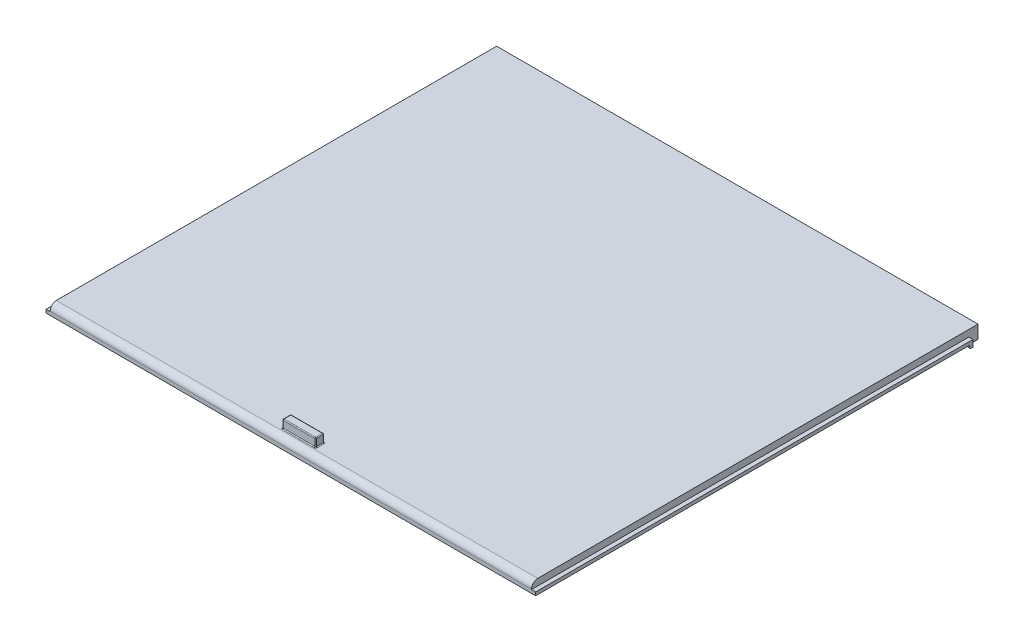
ISO-10303-21;
HEADER;
FILE_DESCRIPTION(('STEP AP214'),'2;1');
FILE_NAME('part.step','',(''),(''),'','','');
FILE_SCHEMA(('AUTOMOTIVE_DESIGN { 1 0 10303 214 1 1 1 1 }'));
ENDSEC;
DATA;
#1=APPLICATION_CONTEXT('core data for automotive mechanical design processes');
#2=APPLICATION_PROTOCOL_DEFINITION('international standard','automotive_design',2000,#1);
#3=PRODUCT_CONTEXT('',#1,'mechanical');
#4=PRODUCT('Part','Part','',(#3));
#5=PRODUCT_RELATED_PRODUCT_CATEGORY('part','',(#4));
#6=PRODUCT_DEFINITION_FORMATION('','',#4);
#7=PRODUCT_DEFINITION_CONTEXT('part definition',#1,'design');
#8=PRODUCT_DEFINITION('design','',#6,#7);
#9=PRODUCT_DEFINITION_SHAPE('','',#8);
#10=(LENGTH_UNIT() NAMED_UNIT(*) SI_UNIT(.MILLI.,.METRE.));
#11=(NAMED_UNIT(*) PLANE_ANGLE_UNIT() SI_UNIT($,.RADIAN.));
#12=(NAMED_UNIT(*) SI_UNIT($,.STERADIAN.) SOLID_ANGLE_UNIT());
#13=UNCERTAINTY_MEASURE_WITH_UNIT(LENGTH_MEASURE(1.E-05),#10,'distance_accuracy_value','');
#14=(GEOMETRIC_REPRESENTATION_CONTEXT(3) GLOBAL_UNCERTAINTY_ASSIGNED_CONTEXT((#13)) GLOBAL_UNIT_ASSIGNED_CONTEXT((#10,
#11,#12)) REPRESENTATION_CONTEXT('',''));
#15=CARTESIAN_POINT('',(0.,0.,0.));
#16=DIRECTION('',(0.,0.,1.));
#17=DIRECTION('',(1.,0.,0.));
#18=AXIS2_PLACEMENT_3D('',#15,#16,#17);
#19=CARTESIAN_POINT('',(29.5,-0.399999999999988,-52.7));
#20=DIRECTION('',(0.,0.,1.));
#21=DIRECTION('',(1.,0.,0.));
#22=AXIS2_PLACEMENT_3D('',#19,#20,#21);
#23=PLANE('',#22);
#24=DIRECTION('',(0.,1.,0.));
#25=VECTOR('',#24,1.);
#26=CARTESIAN_POINT('',(0.500000000000004,0.400000000000012,-52.7));
#27=LINE('',#26,#25);
#28=CARTESIAN_POINT('',(0.500000000000004,-0.399999999999988,-52.7));
#29=VERTEX_POINT('',#28);
#30=CARTESIAN_POINT('',(0.500000000000004,0.400000000000012,-52.7));
#31=VERTEX_POINT('',#30);
#32=EDGE_CURVE('E294',#29,#31,#27,.T.);
#33=ORIENTED_EDGE('',*,*,#32,.F.);
#34=DIRECTION('',(-1.,0.,0.));
#35=VECTOR('',#34,1.);
#36=CARTESIAN_POINT('',(29.5,-0.399999999999988,-52.7));
#37=LINE('',#36,#35);
#38=CARTESIAN_POINT('',(0.,-0.399999999999988,-52.7));
#39=VERTEX_POINT('',#38);
#40=EDGE_CURVE('E321',#29,#39,#37,.T.);
#41=ORIENTED_EDGE('',*,*,#40,.T.);
#42=DIRECTION('',(0.,1.,0.));
#43=VECTOR('',#42,1.);
#44=CARTESIAN_POINT('',(0.,-0.399999999999988,-52.7));
#45=LINE('',#44,#43);
#46=CARTESIAN_POINT('',(0.,0.400000000000012,-52.7));
#47=VERTEX_POINT('',#46);
#48=EDGE_CURVE('E306',#39,#47,#45,.T.);
#49=ORIENTED_EDGE('',*,*,#48,.T.);
#50=DIRECTION('',(-1.,0.,0.));
#51=VECTOR('',#50,1.);
#52=CARTESIAN_POINT('',(29.5,0.400000000000012,-52.7));
#53=LINE('',#52,#51);
#54=EDGE_CURVE('E319',#31,#47,#53,.T.);
#55=ORIENTED_EDGE('',*,*,#54,.F.);
#56=EDGE_LOOP('',(#33,#41,#49,#55));
#57=FACE_BOUND('',#56,.T.);
#58=ADVANCED_FACE('F33',(#57),#23,.F.);
#59=CARTESIAN_POINT('',(29.5,0.4,0.));
#60=DIRECTION('',(0.,-1.,0.));
#61=DIRECTION('',(0.,0.,-1.));
#62=AXIS2_PLACEMENT_3D('',#59,#60,#61);
#63=PLANE('',#62);
#64=DIRECTION('',(0.,0.,1.));
#65=VECTOR('',#64,1.);
#66=CARTESIAN_POINT('',(0.500000000000004,0.4,0.));
#67=LINE('',#66,#65);
#68=CARTESIAN_POINT('',(0.500000000000004,0.4,0.));
#69=VERTEX_POINT('',#68);
#70=EDGE_CURVE('E296',#31,#69,#67,.T.);
#71=ORIENTED_EDGE('',*,*,#70,.F.);
#72=ORIENTED_EDGE('',*,*,#54,.T.);
#73=DIRECTION('',(0.,0.,1.));
#74=VECTOR('',#73,1.);
#75=CARTESIAN_POINT('',(0.,0.4,0.));
#76=LINE('',#75,#74);
#77=CARTESIAN_POINT('',(0.,0.4,0.));
#78=VERTEX_POINT('',#77);
#79=EDGE_CURVE('E309',#47,#78,#76,.T.);
#80=ORIENTED_EDGE('',*,*,#79,.T.);
#81=DIRECTION('',(-1.,0.,0.));
#82=VECTOR('',#81,1.);
#83=CARTESIAN_POINT('',(29.5,0.4,0.));
#84=LINE('',#83,#82);
#85=EDGE_CURVE('E317',#69,#78,#84,.T.);
#86=ORIENTED_EDGE('',*,*,#85,.F.);
#87=EDGE_LOOP('',(#71,#72,#80,#86));
#88=FACE_BOUND('',#87,.T.);
#89=ADVANCED_FACE('F560',(#88),#63,.F.);
#90=CARTESIAN_POINT('',(29.5,0.,-52.2843137254902));
#91=DIRECTION('',(0.,1.,0.));
#92=DIRECTION('',(0.,0.,1.));
#93=AXIS2_PLACEMENT_3D('',#90,#91,#92);
#94=PLANE('',#93);
#95=DIRECTION('',(0.,0.,-1.));
#96=VECTOR('',#95,1.);
#97=CARTESIAN_POINT('',(0.,0.,-52.2843137254902));
#98=LINE('',#97,#96);
#99=CARTESIAN_POINT('',(0.,0.,0.));
#100=VERTEX_POINT('',#99);
#101=CARTESIAN_POINT('',(0.,0.,-52.2843137254902));
#102=VERTEX_POINT('',#101);
#103=EDGE_CURVE('E228',#100,#102,#98,.T.);
#104=ORIENTED_EDGE('',*,*,#103,.T.);
#105=DIRECTION('',(-1.,0.,0.));
#106=VECTOR('',#105,1.);
#107=CARTESIAN_POINT('',(29.5,0.,-52.2843137254902));
#108=LINE('',#107,#106);
#109=CARTESIAN_POINT('',(59.,0.,-52.2843137254902));
#110=VERTEX_POINT('',#109);
#111=EDGE_CURVE('E324',#110,#102,#108,.T.);
#112=ORIENTED_EDGE('',*,*,#111,.F.);
#113=DIRECTION('',(0.,0.,-1.));
#114=VECTOR('',#113,1.);
#115=CARTESIAN_POINT('',(59.,0.,-52.2843137254902));
#116=LINE('',#115,#114);
#117=CARTESIAN_POINT('',(59.,0.,0.));
#118=VERTEX_POINT('',#117);
#119=EDGE_CURVE('E255',#118,#110,#116,.T.);
#120=ORIENTED_EDGE('',*,*,#119,.F.);
#121=DIRECTION('',(-1.,0.,0.));
#122=VECTOR('',#121,1.);
#123=CARTESIAN_POINT('',(29.5,0.,0.));
#124=LINE('',#123,#122);
#125=EDGE_CURVE('E314',#118,#100,#124,.T.);
#126=ORIENTED_EDGE('',*,*,#125,.T.);
#127=EDGE_LOOP('',(#104,#112,#120,#126));
#128=FACE_BOUND('',#127,.T.);
#129=ADVANCED_FACE('F566',(#128),#94,.F.);
#130=CARTESIAN_POINT('',(29.5,0.,-52.2843137254902));
#131=DIRECTION('',(0.,0.,-1.));
#132=DIRECTION('',(-1.,0.,0.));
#133=AXIS2_PLACEMENT_3D('',#130,#131,#132);
#134=PLANE('',#133);
#135=DIRECTION('',(0.,-1.,0.));
#136=VECTOR('',#135,1.);
#137=CARTESIAN_POINT('',(0.,0.,-52.2843137254902));
#138=LINE('',#137,#136);
#139=CARTESIAN_POINT('',(0.,-0.199999999999988,-52.2843137254902));
#140=VERTEX_POINT('',#139);
#141=EDGE_CURVE('E301',#102,#140,#138,.T.);
#142=ORIENTED_EDGE('',*,*,#141,.T.);
#143=DIRECTION('',(-1.,0.,0.));
#144=VECTOR('',#143,1.);
#145=CARTESIAN_POINT('',(29.5,-0.199999999999988,-52.2843137254902));
#146=LINE('',#145,#144);
#147=CARTESIAN_POINT('',(59.,-0.199999999999988,-52.2843137254902));
#148=VERTEX_POINT('',#147);
#149=EDGE_CURVE('E337',#140,#148,#146,.F.);
#150=ORIENTED_EDGE('',*,*,#149,.T.);
#151=DIRECTION('',(0.,-1.,0.));
#152=VECTOR('',#151,1.);
#153=CARTESIAN_POINT('',(59.,0.,-52.2843137254902));
#154=LINE('',#153,#152);
#155=EDGE_CURVE('E258',#110,#148,#154,.T.);
#156=ORIENTED_EDGE('',*,*,#155,.F.);
#157=ORIENTED_EDGE('',*,*,#111,.T.);
#158=EDGE_LOOP('',(#142,#150,#156,#157));
#159=FACE_BOUND('',#158,.T.);
#160=ADVANCED_FACE('F576',(#159),#134,.F.);
#161=CARTESIAN_POINT('',(29.5,-0.399999999999988,-52.2843137254902));
#162=DIRECTION('',(0.,1.,0.));
#163=DIRECTION('',(0.,0.,1.));
#164=AXIS2_PLACEMENT_3D('',#161,#162,#163);
#165=PLANE('',#164);
#166=DIRECTION('',(1.,0.,0.));
#167=VECTOR('',#166,1.);
#168=CARTESIAN_POINT('',(0.500000000000004,-0.399999999999988,-53.8));
#169=LINE('',#168,#167);
#170=CARTESIAN_POINT('',(0.500000000000004,-0.399999999999988,-53.8));
#171=VERTEX_POINT('',#170);
#172=CARTESIAN_POINT('',(58.5,-0.399999999999988,-53.8));
#173=VERTEX_POINT('',#172);
#174=EDGE_CURVE('E229',#171,#173,#169,.T.);
#175=ORIENTED_EDGE('',*,*,#174,.T.);
#176=DIRECTION('',(0.,0.,1.));
#177=VECTOR('',#176,1.);
#178=CARTESIAN_POINT('',(58.5,-0.399999999999988,-52.7));
#179=LINE('',#178,#177);
#180=CARTESIAN_POINT('',(58.5,-0.399999999999988,-52.7));
#181=VERTEX_POINT('',#180);
#182=EDGE_CURVE('E237',#173,#181,#179,.T.);
#183=ORIENTED_EDGE('',*,*,#182,.T.);
#184=DIRECTION('',(1.,0.,0.));
#185=VECTOR('',#184,1.);
#186=CARTESIAN_POINT('',(29.5,-0.399999999999988,-52.7));
#187=LINE('',#186,#185);
#188=CARTESIAN_POINT('',(59.,-0.399999999999988,-52.7));
#189=VERTEX_POINT('',#188);
#190=EDGE_CURVE('E278',#181,#189,#187,.T.);
#191=ORIENTED_EDGE('',*,*,#190,.T.);
#192=DIRECTION('',(0.,0.,-1.));
#193=VECTOR('',#192,1.);
#194=CARTESIAN_POINT('',(59.,-0.399999999999988,-52.2843137254902));
#195=LINE('',#194,#193);
#196=CARTESIAN_POINT('',(59.,-0.399999999999988,-52.4843137254902));
#197=VERTEX_POINT('',#196);
#198=EDGE_CURVE('E261',#197,#189,#195,.T.);
#199=ORIENTED_EDGE('',*,*,#198,.F.);
#200=DIRECTION('',(-1.,0.,0.));
#201=VECTOR('',#200,1.);
#202=CARTESIAN_POINT('',(29.5,-0.399999999999988,-52.4843137254902));
#203=LINE('',#202,#201);
#204=CARTESIAN_POINT('',(0.,-0.399999999999988,-52.4843137254902));
#205=VERTEX_POINT('',#204);
#206=EDGE_CURVE('E332',#197,#205,#203,.T.);
#207=ORIENTED_EDGE('',*,*,#206,.T.);
#208=DIRECTION('',(0.,0.,-1.));
#209=VECTOR('',#208,1.);
#210=CARTESIAN_POINT('',(0.,-0.399999999999988,-52.2843137254902));
#211=LINE('',#210,#209);
#212=EDGE_CURVE('E304',#205,#39,#211,.T.);
#213=ORIENTED_EDGE('',*,*,#212,.T.);
#214=ORIENTED_EDGE('',*,*,#40,.F.);
#215=DIRECTION('',(0.,0.,1.));
#216=VECTOR('',#215,1.);
#217=CARTESIAN_POINT('',(0.500000000000004,-0.399999999999988,-52.7));
#218=LINE('',#217,#216);
#219=EDGE_CURVE('E292',#171,#29,#218,.T.);
#220=ORIENTED_EDGE('',*,*,#219,.F.);
#221=EDGE_LOOP('',(#175,#183,#191,#199,#207,#213,#214,#220));
#222=FACE_BOUND('',#221,.T.);
#223=ADVANCED_FACE('F572',(#222),#165,.F.);
#224=CARTESIAN_POINT('',(29.5,0.,0.));
#225=DIRECTION('',(0.,0.,-1.));
#226=DIRECTION('',(-1.,0.,0.));
#227=AXIS2_PLACEMENT_3D('',#224,#225,#226);
#228=PLANE('',#227);
#229=ORIENTED_EDGE('',*,*,#125,.F.);
#230=DIRECTION('',(0.,-1.,0.));
#231=VECTOR('',#230,1.);
#232=CARTESIAN_POINT('',(59.,0.,0.));
#233=LINE('',#232,#231);
#234=CARTESIAN_POINT('',(59.,0.4,0.));
#235=VERTEX_POINT('',#234);
#236=EDGE_CURVE('E269',#235,#118,#233,.T.);
#237=ORIENTED_EDGE('',*,*,#236,.F.);
#238=DIRECTION('',(1.,0.,0.));
#239=VECTOR('',#238,1.);
#240=CARTESIAN_POINT('',(29.5,0.4,0.));
#241=LINE('',#240,#239);
#242=CARTESIAN_POINT('',(58.5,0.4,0.));
#243=VERTEX_POINT('',#242);
#244=EDGE_CURVE('E272',#243,#235,#241,.T.);
#245=ORIENTED_EDGE('',*,*,#244,.F.);
#246=DIRECTION('',(0.,1.,0.));
#247=VECTOR('',#246,1.);
#248=CARTESIAN_POINT('',(58.5,1.2,0.));
#249=LINE('',#248,#247);
#250=CARTESIAN_POINT('',(58.5,0.45,0.));
#251=VERTEX_POINT('',#250);
#252=EDGE_CURVE('E243',#243,#251,#249,.T.);
#253=ORIENTED_EDGE('',*,*,#252,.T.);
#254=DIRECTION('',(1.,0.,0.));
#255=VECTOR('',#254,1.);
#256=CARTESIAN_POINT('',(29.5,0.45,0.));
#257=LINE('',#256,#255);
#258=CARTESIAN_POINT('',(0.500000000000004,0.45,0.));
#259=VERTEX_POINT('',#258);
#260=EDGE_CURVE('E328',#251,#259,#257,.F.);
#261=ORIENTED_EDGE('',*,*,#260,.T.);
#262=DIRECTION('',(0.,1.,0.));
#263=VECTOR('',#262,1.);
#264=CARTESIAN_POINT('',(0.500000000000004,1.2,0.));
#265=LINE('',#264,#263);
#266=EDGE_CURVE('E286',#69,#259,#265,.T.);
#267=ORIENTED_EDGE('',*,*,#266,.F.);
#268=ORIENTED_EDGE('',*,*,#85,.T.);
#269=DIRECTION('',(0.,-1.,0.));
#270=VECTOR('',#269,1.);
#271=CARTESIAN_POINT('',(0.,0.,0.));
#272=LINE('',#271,#270);
#273=EDGE_CURVE('E312',#78,#100,#272,.T.);
#274=ORIENTED_EDGE('',*,*,#273,.T.);
#275=EDGE_LOOP('',(#229,#237,#245,#253,#261,#267,#268,#274));
#276=FACE_BOUND('',#275,.T.);
#277=ADVANCED_FACE('F575',(#276),#228,.F.);
#278=CARTESIAN_POINT('',(0.,0.,0.));
#279=DIRECTION('',(-1.,0.,0.));
#280=DIRECTION('',(0.,0.,1.));
#281=AXIS2_PLACEMENT_3D('',#278,#279,#280);
#282=PLANE('',#281);
#283=ORIENTED_EDGE('',*,*,#212,.F.);
#284=CARTESIAN_POINT('',(0.,-0.199999999999988,-52.4843137254902));
#285=DIRECTION('',(-1.,0.,0.));
#286=DIRECTION('',(0.,0.,1.));
#287=AXIS2_PLACEMENT_3D('',#284,#285,#286);
#288=CIRCLE('',#287,0.2);
#289=EDGE_CURVE('E335',#205,#140,#288,.T.);
#290=ORIENTED_EDGE('',*,*,#289,.T.);
#291=ORIENTED_EDGE('',*,*,#141,.F.);
#292=ORIENTED_EDGE('',*,*,#103,.F.);
#293=ORIENTED_EDGE('',*,*,#273,.F.);
#294=ORIENTED_EDGE('',*,*,#79,.F.);
#295=ORIENTED_EDGE('',*,*,#48,.F.);
#296=EDGE_LOOP('',(#283,#290,#291,#292,#293,#294,#295));
#297=FACE_BOUND('',#296,.T.);
#298=ADVANCED_FACE('F727',(#297),#282,.T.);
#299=CARTESIAN_POINT('',(0.500000000000004,1.2,-53.8));
#300=DIRECTION('',(0.,-1.,0.));
#301=DIRECTION('',(0.,0.,-1.));
#302=AXIS2_PLACEMENT_3D('',#299,#300,#301);
#303=PLANE('',#302);
#304=CARTESIAN_POINT('',(31.4,1.2,-1.09614138385164));
#305=DIRECTION('',(0.,-1.,0.));
#306=DIRECTION('',(0.,0.,-1.));
#307=AXIS2_PLACEMENT_3D('',#304,#305,#306);
#308=CIRCLE('',#307,0.2);
#309=CARTESIAN_POINT('',(31.4,1.2,-0.896141383851641));
#310=VERTEX_POINT('',#309);
#311=CARTESIAN_POINT('',(31.6,1.2,-1.09614138385164));
#312=VERTEX_POINT('',#311);
#313=EDGE_CURVE('E53',#310,#312,#308,.F.);
#314=ORIENTED_EDGE('',*,*,#313,.F.);
#315=DIRECTION('',(-1.,0.,0.));
#316=VECTOR('',#315,1.);
#317=CARTESIAN_POINT('',(0.500000000000004,1.2,-0.896141383851641));
#318=LINE('',#317,#316);
#319=CARTESIAN_POINT('',(27.6,1.2,-0.896141383851641));
#320=VERTEX_POINT('',#319);
#321=EDGE_CURVE('E11',#310,#320,#318,.T.);
#322=ORIENTED_EDGE('',*,*,#321,.T.);
#323=CARTESIAN_POINT('',(27.6,1.2,-1.09614138385164));
#324=DIRECTION('',(0.,-1.,0.));
#325=DIRECTION('',(0.,0.,-1.));
#326=AXIS2_PLACEMENT_3D('',#323,#324,#325);
#327=CIRCLE('',#326,0.2);
#328=CARTESIAN_POINT('',(27.4,1.2,-1.09614138385164));
#329=VERTEX_POINT('',#328);
#330=EDGE_CURVE('E42',#329,#320,#327,.F.);
#331=ORIENTED_EDGE('',*,*,#330,.F.);
#332=DIRECTION('',(0.,0.,-1.));
#333=VECTOR('',#332,1.);
#334=CARTESIAN_POINT('',(27.4,1.2,-53.8));
#335=LINE('',#334,#333);
#336=CARTESIAN_POINT('',(27.4,1.2,-1.89614138385164));
#337=VERTEX_POINT('',#336);
#338=EDGE_CURVE('E393',#329,#337,#335,.T.);
#339=ORIENTED_EDGE('',*,*,#338,.T.);
#340=CARTESIAN_POINT('',(27.6,1.2,-1.89614138385164));
#341=DIRECTION('',(0.,-1.,0.));
#342=DIRECTION('',(0.,0.,-1.));
#343=AXIS2_PLACEMENT_3D('',#340,#341,#342);
#344=CIRCLE('',#343,0.2);
#345=CARTESIAN_POINT('',(27.6,1.2,-2.09614138385164));
#346=VERTEX_POINT('',#345);
#347=EDGE_CURVE('E391',#346,#337,#344,.F.);
#348=ORIENTED_EDGE('',*,*,#347,.F.);
#349=DIRECTION('',(-1.,0.,0.));
#350=VECTOR('',#349,1.);
#351=CARTESIAN_POINT('',(0.500000000000004,1.2,-2.09614138385164));
#352=LINE('',#351,#350);
#353=CARTESIAN_POINT('',(31.4,1.2,-2.09614138385164));
#354=VERTEX_POINT('',#353);
#355=EDGE_CURVE('E387',#346,#354,#352,.F.);
#356=ORIENTED_EDGE('',*,*,#355,.T.);
#357=CARTESIAN_POINT('',(31.4,1.2,-1.89614138385164));
#358=DIRECTION('',(0.,-1.,0.));
#359=DIRECTION('',(0.,0.,-1.));
#360=AXIS2_PLACEMENT_3D('',#357,#358,#359);
#361=CIRCLE('',#360,0.2);
#362=CARTESIAN_POINT('',(31.6,1.2,-1.89614138385164));
#363=VERTEX_POINT('',#362);
#364=EDGE_CURVE('E384',#363,#354,#361,.F.);
#365=ORIENTED_EDGE('',*,*,#364,.F.);
#366=DIRECTION('',(0.,0.,-1.));
#367=VECTOR('',#366,1.);
#368=CARTESIAN_POINT('',(31.6,1.2,-53.8));
#369=LINE('',#368,#367);
#370=EDGE_CURVE('E389',#363,#312,#369,.F.);
#371=ORIENTED_EDGE('',*,*,#370,.T.);
#372=EDGE_LOOP('',(#314,#322,#331,#339,#348,#356,#365,#371));
#373=FACE_BOUND('',#372,.T.);
#374=DIRECTION('',(0.,0.,-1.));
#375=VECTOR('',#374,1.);
#376=CARTESIAN_POINT('',(0.500000000000004,1.2,-53.8));
#377=LINE('',#376,#375);
#378=CARTESIAN_POINT('',(0.500000000000004,1.2,-0.750000000000015));
#379=VERTEX_POINT('',#378);
#380=CARTESIAN_POINT('',(0.500000000000004,1.2,-53.8));
#381=VERTEX_POINT('',#380);
#382=EDGE_CURVE('E289',#379,#381,#377,.T.);
#383=ORIENTED_EDGE('',*,*,#382,.F.);
#384=DIRECTION('',(1.,0.,0.));
#385=VECTOR('',#384,1.);
#386=CARTESIAN_POINT('',(0.500000000000004,1.2,-0.750000000000001));
#387=LINE('',#386,#385);
#388=CARTESIAN_POINT('',(58.5,1.2,-0.750000000000015));
#389=VERTEX_POINT('',#388);
#390=EDGE_CURVE('E241',#379,#389,#387,.T.);
#391=ORIENTED_EDGE('',*,*,#390,.T.);
#392=DIRECTION('',(0.,0.,-1.));
#393=VECTOR('',#392,1.);
#394=CARTESIAN_POINT('',(58.5,1.2,-53.8));
#395=LINE('',#394,#393);
#396=CARTESIAN_POINT('',(58.5,1.2,-53.8));
#397=VERTEX_POINT('',#396);
#398=EDGE_CURVE('E235',#389,#397,#395,.T.);
#399=ORIENTED_EDGE('',*,*,#398,.T.);
#400=DIRECTION('',(1.,0.,0.));
#401=VECTOR('',#400,1.);
#402=CARTESIAN_POINT('',(0.500000000000004,1.2,-53.8));
#403=LINE('',#402,#401);
#404=EDGE_CURVE('E218',#381,#397,#403,.T.);
#405=ORIENTED_EDGE('',*,*,#404,.F.);
#406=EDGE_LOOP('',(#383,#391,#399,#405));
#407=FACE_BOUND('',#406,.T.);
#408=ADVANCED_FACE('F239',(#373,#407),#303,.F.);
#409=CARTESIAN_POINT('',(0.500000000000004,-0.399999999999988,-53.8));
#410=DIRECTION('',(0.,0.,1.));
#411=DIRECTION('',(1.,0.,0.));
#412=AXIS2_PLACEMENT_3D('',#409,#410,#411);
#413=PLANE('',#412);
#414=ORIENTED_EDGE('',*,*,#404,.T.);
#415=DIRECTION('',(0.,-1.,0.));
#416=VECTOR('',#415,1.);
#417=CARTESIAN_POINT('',(58.5,-0.399999999999988,-53.8));
#418=LINE('',#417,#416);
#419=EDGE_CURVE('E222',#397,#173,#418,.T.);
#420=ORIENTED_EDGE('',*,*,#419,.T.);
#421=ORIENTED_EDGE('',*,*,#174,.F.);
#422=DIRECTION('',(0.,-1.,0.));
#423=VECTOR('',#422,1.);
#424=CARTESIAN_POINT('',(0.500000000000004,-0.399999999999988,-53.8));
#425=LINE('',#424,#423);
#426=EDGE_CURVE('E224',#381,#171,#425,.T.);
#427=ORIENTED_EDGE('',*,*,#426,.F.);
#428=EDGE_LOOP('',(#414,#420,#421,#427));
#429=FACE_BOUND('',#428,.T.);
#430=ADVANCED_FACE('F220',(#429),#413,.F.);
#431=CARTESIAN_POINT('',(0.500000000000004,0.,0.));
#432=DIRECTION('',(1.,0.,0.));
#433=DIRECTION('',(0.,0.,-1.));
#434=AXIS2_PLACEMENT_3D('',#431,#432,#433);
#435=PLANE('',#434);
#436=ORIENTED_EDGE('',*,*,#266,.T.);
#437=CARTESIAN_POINT('',(0.500000000000004,0.45,-0.750000000000001));
#438=DIRECTION('',(1.,0.,0.));
#439=DIRECTION('',(0.,0.,-1.));
#440=AXIS2_PLACEMENT_3D('',#437,#438,#439);
#441=CIRCLE('',#440,0.75);
#442=EDGE_CURVE('E330',#259,#379,#441,.F.);
#443=ORIENTED_EDGE('',*,*,#442,.T.);
#444=ORIENTED_EDGE('',*,*,#382,.T.);
#445=ORIENTED_EDGE('',*,*,#426,.T.);
#446=ORIENTED_EDGE('',*,*,#219,.T.);
#447=ORIENTED_EDGE('',*,*,#32,.T.);
#448=ORIENTED_EDGE('',*,*,#70,.T.);
#449=EDGE_LOOP('',(#436,#443,#444,#445,#446,#447,#448));
#450=FACE_BOUND('',#449,.T.);
#451=ADVANCED_FACE('F588',(#450),#435,.F.);
#452=CARTESIAN_POINT('',(0.500000000000004,0.45,-0.750000000000001));
#453=DIRECTION('',(1.,0.,0.));
#454=DIRECTION('',(0.,0.,-1.));
#455=AXIS2_PLACEMENT_3D('',#452,#453,#454);
#456=CYLINDRICAL_SURFACE('',#455,0.75);
#457=ORIENTED_EDGE('',*,*,#442,.F.);
#458=ORIENTED_EDGE('',*,*,#260,.F.);
#459=CARTESIAN_POINT('',(58.5,0.45,-0.750000000000001));
#460=DIRECTION('',(1.,0.,0.));
#461=DIRECTION('',(0.,0.,-1.));
#462=AXIS2_PLACEMENT_3D('',#459,#460,#461);
#463=CIRCLE('',#462,0.75);
#464=EDGE_CURVE('E281',#251,#389,#463,.F.);
#465=ORIENTED_EDGE('',*,*,#464,.T.);
#466=ORIENTED_EDGE('',*,*,#390,.F.);
#467=EDGE_LOOP('',(#457,#458,#465,#466));
#468=FACE_BOUND('',#467,.T.);
#469=ADVANCED_FACE('F584',(#468),#456,.T.);
#470=CARTESIAN_POINT('',(29.5,-0.199999999999988,-52.4843137254902));
#471=DIRECTION('',(-1.,0.,0.));
#472=DIRECTION('',(0.,0.,1.));
#473=AXIS2_PLACEMENT_3D('',#470,#471,#472);
#474=CYLINDRICAL_SURFACE('',#473,0.2);
#475=ORIENTED_EDGE('',*,*,#206,.F.);
#476=CARTESIAN_POINT('',(59.,-0.199999999999988,-52.4843137254902));
#477=DIRECTION('',(-1.,0.,0.));
#478=DIRECTION('',(0.,0.,1.));
#479=AXIS2_PLACEMENT_3D('',#476,#477,#478);
#480=CIRCLE('',#479,0.2);
#481=EDGE_CURVE('E283',#197,#148,#480,.T.);
#482=ORIENTED_EDGE('',*,*,#481,.T.);
#483=ORIENTED_EDGE('',*,*,#149,.F.);
#484=ORIENTED_EDGE('',*,*,#289,.F.);
#485=EDGE_LOOP('',(#475,#482,#483,#484));
#486=FACE_BOUND('',#485,.T.);
#487=ADVANCED_FACE('F587',(#486),#474,.T.);
#488=CARTESIAN_POINT('',(29.5,-0.399999999999988,-52.7));
#489=DIRECTION('',(0.,0.,1.));
#490=DIRECTION('',(-1.,0.,0.));
#491=AXIS2_PLACEMENT_3D('',#488,#489,#490);
#492=PLANE('',#491);
#493=DIRECTION('',(0.,1.,0.));
#494=VECTOR('',#493,1.);
#495=CARTESIAN_POINT('',(58.5,0.400000000000012,-52.7));
#496=LINE('',#495,#494);
#497=CARTESIAN_POINT('',(58.5,0.400000000000012,-52.7));
#498=VERTEX_POINT('',#497);
#499=EDGE_CURVE('E249',#181,#498,#496,.T.);
#500=ORIENTED_EDGE('',*,*,#499,.T.);
#501=DIRECTION('',(1.,0.,0.));
#502=VECTOR('',#501,1.);
#503=CARTESIAN_POINT('',(29.5,0.400000000000012,-52.7));
#504=LINE('',#503,#502);
#505=CARTESIAN_POINT('',(59.,0.400000000000012,-52.7));
#506=VERTEX_POINT('',#505);
#507=EDGE_CURVE('E275',#498,#506,#504,.T.);
#508=ORIENTED_EDGE('',*,*,#507,.T.);
#509=DIRECTION('',(0.,1.,0.));
#510=VECTOR('',#509,1.);
#511=CARTESIAN_POINT('',(59.,-0.399999999999988,-52.7));
#512=LINE('',#511,#510);
#513=EDGE_CURVE('E263',#189,#506,#512,.T.);
#514=ORIENTED_EDGE('',*,*,#513,.F.);
#515=ORIENTED_EDGE('',*,*,#190,.F.);
#516=EDGE_LOOP('',(#500,#508,#514,#515));
#517=FACE_BOUND('',#516,.T.);
#518=ADVANCED_FACE('F592',(#517),#492,.F.);
#519=CARTESIAN_POINT('',(29.5,0.4,0.));
#520=DIRECTION('',(0.,-1.,0.));
#521=DIRECTION('',(0.,0.,-1.));
#522=AXIS2_PLACEMENT_3D('',#519,#520,#521);
#523=PLANE('',#522);
#524=DIRECTION('',(0.,0.,1.));
#525=VECTOR('',#524,1.);
#526=CARTESIAN_POINT('',(58.5,0.4,0.));
#527=LINE('',#526,#525);
#528=EDGE_CURVE('E252',#498,#243,#527,.T.);
#529=ORIENTED_EDGE('',*,*,#528,.T.);
#530=ORIENTED_EDGE('',*,*,#244,.T.);
#531=DIRECTION('',(0.,0.,1.));
#532=VECTOR('',#531,1.);
#533=CARTESIAN_POINT('',(59.,0.4,0.));
#534=LINE('',#533,#532);
#535=EDGE_CURVE('E266',#506,#235,#534,.T.);
#536=ORIENTED_EDGE('',*,*,#535,.F.);
#537=ORIENTED_EDGE('',*,*,#507,.F.);
#538=EDGE_LOOP('',(#529,#530,#536,#537));
#539=FACE_BOUND('',#538,.T.);
#540=ADVANCED_FACE('F681',(#539),#523,.F.);
#541=CARTESIAN_POINT('',(59.,0.,0.));
#542=DIRECTION('',(1.,0.,0.));
#543=DIRECTION('',(0.,0.,1.));
#544=AXIS2_PLACEMENT_3D('',#541,#542,#543);
#545=PLANE('',#544);
#546=ORIENTED_EDGE('',*,*,#198,.T.);
#547=ORIENTED_EDGE('',*,*,#513,.T.);
#548=ORIENTED_EDGE('',*,*,#535,.T.);
#549=ORIENTED_EDGE('',*,*,#236,.T.);
#550=ORIENTED_EDGE('',*,*,#119,.T.);
#551=ORIENTED_EDGE('',*,*,#155,.T.);
#552=ORIENTED_EDGE('',*,*,#481,.F.);
#553=EDGE_LOOP('',(#546,#547,#548,#549,#550,#551,#552));
#554=FACE_BOUND('',#553,.T.);
#555=ADVANCED_FACE('F675',(#554),#545,.T.);
#556=CARTESIAN_POINT('',(58.5,0.,0.));
#557=DIRECTION('',(-1.,0.,0.));
#558=DIRECTION('',(0.,0.,-1.));
#559=AXIS2_PLACEMENT_3D('',#556,#557,#558);
#560=PLANE('',#559);
#561=ORIENTED_EDGE('',*,*,#252,.F.);
#562=ORIENTED_EDGE('',*,*,#528,.F.);
#563=ORIENTED_EDGE('',*,*,#499,.F.);
#564=ORIENTED_EDGE('',*,*,#182,.F.);
#565=ORIENTED_EDGE('',*,*,#419,.F.);
#566=ORIENTED_EDGE('',*,*,#398,.F.);
#567=ORIENTED_EDGE('',*,*,#464,.F.);
#568=EDGE_LOOP('',(#561,#562,#563,#564,#565,#566,#567));
#569=FACE_BOUND('',#568,.T.);
#570=ADVANCED_FACE('F233',(#569),#560,.F.);
#571=CARTESIAN_POINT('',(31.5,1.2,-0.996141383851642));
#572=DIRECTION('',(0.,0.,1.));
#573=DIRECTION('',(-1.,0.,0.));
#574=AXIS2_PLACEMENT_3D('',#571,#572,#573);
#575=PLANE('',#574);
#576=DIRECTION('',(0.,-1.,0.));
#577=VECTOR('',#576,1.);
#578=CARTESIAN_POINT('',(31.4,1.2,-0.996141383851642));
#579=LINE('',#578,#577);
#580=CARTESIAN_POINT('',(31.4,1.3,-0.996141383851642));
#581=VERTEX_POINT('',#580);
#582=CARTESIAN_POINT('',(31.4,2.1,-0.996141383851642));
#583=VERTEX_POINT('',#582);
#584=EDGE_CURVE('E377',#581,#583,#579,.F.);
#585=ORIENTED_EDGE('',*,*,#584,.T.);
#586=DIRECTION('',(-1.,0.,0.));
#587=VECTOR('',#586,1.);
#588=CARTESIAN_POINT('',(31.5,2.1,-0.996141383851642));
#589=LINE('',#588,#587);
#590=CARTESIAN_POINT('',(27.6,2.1,-0.996141383851642));
#591=VERTEX_POINT('',#590);
#592=EDGE_CURVE('E381',#583,#591,#589,.T.);
#593=ORIENTED_EDGE('',*,*,#592,.T.);
#594=DIRECTION('',(0.,-1.,0.));
#595=VECTOR('',#594,1.);
#596=CARTESIAN_POINT('',(27.6,1.2,-0.996141383851642));
#597=LINE('',#596,#595);
#598=CARTESIAN_POINT('',(27.6,1.3,-0.996141383851642));
#599=VERTEX_POINT('',#598);
#600=EDGE_CURVE('E379',#591,#599,#597,.T.);
#601=ORIENTED_EDGE('',*,*,#600,.T.);
#602=DIRECTION('',(-1.,0.,0.));
#603=VECTOR('',#602,1.);
#604=CARTESIAN_POINT('',(31.5,1.3,-0.996141383851642));
#605=LINE('',#604,#603);
#606=EDGE_CURVE('E375',#599,#581,#605,.F.);
#607=ORIENTED_EDGE('',*,*,#606,.T.);
#608=EDGE_LOOP('',(#585,#593,#601,#607));
#609=FACE_BOUND('',#608,.T.);
#610=ADVANCED_FACE('F550',(#609),#575,.T.);
#611=CARTESIAN_POINT('',(31.5,2.2,-0.996141383851642));
#612=DIRECTION('',(0.,1.,0.));
#613=DIRECTION('',(0.,0.,1.));
#614=AXIS2_PLACEMENT_3D('',#611,#612,#613);
#615=PLANE('',#614);
#616=DIRECTION('',(-1.,0.,0.));
#617=VECTOR('',#616,1.);
#618=CARTESIAN_POINT('',(31.5,2.2,-1.89614138385164));
#619=LINE('',#618,#617);
#620=CARTESIAN_POINT('',(31.4,2.2,-1.89614138385164));
#621=VERTEX_POINT('',#620);
#622=CARTESIAN_POINT('',(27.6,2.2,-1.89614138385164));
#623=VERTEX_POINT('',#622);
#624=EDGE_CURVE('E343',#621,#623,#619,.T.);
#625=ORIENTED_EDGE('',*,*,#624,.T.);
#626=DIRECTION('',(0.,0.,1.));
#627=VECTOR('',#626,1.);
#628=CARTESIAN_POINT('',(27.6,2.2,-0.996141383851642));
#629=LINE('',#628,#627);
#630=CARTESIAN_POINT('',(27.6,2.2,-1.09614138385164));
#631=VERTEX_POINT('',#630);
#632=EDGE_CURVE('E345',#623,#631,#629,.T.);
#633=ORIENTED_EDGE('',*,*,#632,.T.);
#634=DIRECTION('',(-1.,0.,0.));
#635=VECTOR('',#634,1.);
#636=CARTESIAN_POINT('',(31.5,2.2,-1.09614138385164));
#637=LINE('',#636,#635);
#638=CARTESIAN_POINT('',(31.4,2.2,-1.09614138385164));
#639=VERTEX_POINT('',#638);
#640=EDGE_CURVE('E339',#631,#639,#637,.F.);
#641=ORIENTED_EDGE('',*,*,#640,.T.);
#642=DIRECTION('',(0.,0.,1.));
#643=VECTOR('',#642,1.);
#644=CARTESIAN_POINT('',(31.4,2.2,-0.996141383851642));
#645=LINE('',#644,#643);
#646=EDGE_CURVE('E341',#639,#621,#645,.F.);
#647=ORIENTED_EDGE('',*,*,#646,.T.);
#648=EDGE_LOOP('',(#625,#633,#641,#647));
#649=FACE_BOUND('',#648,.T.);
#650=ADVANCED_FACE('F548',(#649),#615,.T.);
#651=CARTESIAN_POINT('',(31.5,2.2,-1.99614138385164));
#652=DIRECTION('',(0.,0.,-1.));
#653=DIRECTION('',(1.,0.,0.));
#654=AXIS2_PLACEMENT_3D('',#651,#652,#653);
#655=PLANE('',#654);
#656=DIRECTION('',(0.,1.,0.));
#657=VECTOR('',#656,1.);
#658=CARTESIAN_POINT('',(27.6,2.2,-1.99614138385164));
#659=LINE('',#658,#657);
#660=CARTESIAN_POINT('',(27.6,1.3,-1.99614138385164));
#661=VERTEX_POINT('',#660);
#662=CARTESIAN_POINT('',(27.6,2.1,-1.99614138385164));
#663=VERTEX_POINT('',#662);
#664=EDGE_CURVE('E361',#661,#663,#659,.T.);
#665=ORIENTED_EDGE('',*,*,#664,.T.);
#666=DIRECTION('',(-1.,0.,0.));
#667=VECTOR('',#666,1.);
#668=CARTESIAN_POINT('',(31.5,2.1,-1.99614138385164));
#669=LINE('',#668,#667);
#670=CARTESIAN_POINT('',(31.4,2.1,-1.99614138385164));
#671=VERTEX_POINT('',#670);
#672=EDGE_CURVE('E363',#663,#671,#669,.F.);
#673=ORIENTED_EDGE('',*,*,#672,.T.);
#674=DIRECTION('',(0.,1.,0.));
#675=VECTOR('',#674,1.);
#676=CARTESIAN_POINT('',(31.4,2.2,-1.99614138385164));
#677=LINE('',#676,#675);
#678=CARTESIAN_POINT('',(31.4,1.3,-1.99614138385164));
#679=VERTEX_POINT('',#678);
#680=EDGE_CURVE('E359',#671,#679,#677,.F.);
#681=ORIENTED_EDGE('',*,*,#680,.T.);
#682=DIRECTION('',(-1.,0.,0.));
#683=VECTOR('',#682,1.);
#684=CARTESIAN_POINT('',(31.5,1.3,-1.99614138385164));
#685=LINE('',#684,#683);
#686=EDGE_CURVE('E357',#679,#661,#685,.T.);
#687=ORIENTED_EDGE('',*,*,#686,.T.);
#688=EDGE_LOOP('',(#665,#673,#681,#687));
#689=FACE_BOUND('',#688,.T.);
#690=ADVANCED_FACE('F490',(#689),#655,.T.);
#691=CARTESIAN_POINT('',(31.5,0.,0.));
#692=DIRECTION('',(1.,0.,0.));
#693=DIRECTION('',(0.,0.,1.));
#694=AXIS2_PLACEMENT_3D('',#691,#692,#693);
#695=PLANE('',#694);
#696=DIRECTION('',(0.,1.,0.));
#697=VECTOR('',#696,1.);
#698=CARTESIAN_POINT('',(31.5,0.,-1.89614138385164));
#699=LINE('',#698,#697);
#700=CARTESIAN_POINT('',(31.5,1.3,-1.89614138385164));
#701=VERTEX_POINT('',#700);
#702=CARTESIAN_POINT('',(31.5,2.1,-1.89614138385164));
#703=VERTEX_POINT('',#702);
#704=EDGE_CURVE('E370',#701,#703,#699,.T.);
#705=ORIENTED_EDGE('',*,*,#704,.T.);
#706=DIRECTION('',(0.,0.,1.));
#707=VECTOR('',#706,1.);
#708=CARTESIAN_POINT('',(31.5,2.1,0.));
#709=LINE('',#708,#707);
#710=CARTESIAN_POINT('',(31.5,2.1,-1.09614138385164));
#711=VERTEX_POINT('',#710);
#712=EDGE_CURVE('E372',#703,#711,#709,.T.);
#713=ORIENTED_EDGE('',*,*,#712,.T.);
#714=DIRECTION('',(0.,-1.,0.));
#715=VECTOR('',#714,1.);
#716=CARTESIAN_POINT('',(31.5,0.,-1.09614138385164));
#717=LINE('',#716,#715);
#718=CARTESIAN_POINT('',(31.5,1.3,-1.09614138385164));
#719=VERTEX_POINT('',#718);
#720=EDGE_CURVE('E368',#711,#719,#717,.T.);
#721=ORIENTED_EDGE('',*,*,#720,.T.);
#722=DIRECTION('',(0.,0.,-1.));
#723=VECTOR('',#722,1.);
#724=CARTESIAN_POINT('',(31.5,1.3,0.));
#725=LINE('',#724,#723);
#726=EDGE_CURVE('E366',#719,#701,#725,.T.);
#727=ORIENTED_EDGE('',*,*,#726,.T.);
#728=EDGE_LOOP('',(#705,#713,#721,#727));
#729=FACE_BOUND('',#728,.T.);
#730=ADVANCED_FACE('F506',(#729),#695,.T.);
#731=CARTESIAN_POINT('',(27.5,0.,0.));
#732=DIRECTION('',(-1.,0.,0.));
#733=DIRECTION('',(0.,0.,1.));
#734=AXIS2_PLACEMENT_3D('',#731,#732,#733);
#735=PLANE('',#734);
#736=DIRECTION('',(0.,-1.,0.));
#737=VECTOR('',#736,1.);
#738=CARTESIAN_POINT('',(27.5,0.,-1.09614138385164));
#739=LINE('',#738,#737);
#740=CARTESIAN_POINT('',(27.5,1.3,-1.09614138385164));
#741=VERTEX_POINT('',#740);
#742=CARTESIAN_POINT('',(27.5,2.1,-1.09614138385164));
#743=VERTEX_POINT('',#742);
#744=EDGE_CURVE('E350',#741,#743,#739,.F.);
#745=ORIENTED_EDGE('',*,*,#744,.T.);
#746=DIRECTION('',(0.,0.,1.));
#747=VECTOR('',#746,1.);
#748=CARTESIAN_POINT('',(27.5,2.1,0.));
#749=LINE('',#748,#747);
#750=CARTESIAN_POINT('',(27.5,2.1,-1.89614138385164));
#751=VERTEX_POINT('',#750);
#752=EDGE_CURVE('E354',#743,#751,#749,.F.);
#753=ORIENTED_EDGE('',*,*,#752,.T.);
#754=DIRECTION('',(0.,1.,0.));
#755=VECTOR('',#754,1.);
#756=CARTESIAN_POINT('',(27.5,0.,-1.89614138385164));
#757=LINE('',#756,#755);
#758=CARTESIAN_POINT('',(27.5,1.3,-1.89614138385164));
#759=VERTEX_POINT('',#758);
#760=EDGE_CURVE('E352',#751,#759,#757,.F.);
#761=ORIENTED_EDGE('',*,*,#760,.T.);
#762=DIRECTION('',(0.,0.,-1.));
#763=VECTOR('',#762,1.);
#764=CARTESIAN_POINT('',(27.5,1.3,0.));
#765=LINE('',#764,#763);
#766=EDGE_CURVE('E348',#759,#741,#765,.F.);
#767=ORIENTED_EDGE('',*,*,#766,.T.);
#768=EDGE_LOOP('',(#745,#753,#761,#767));
#769=FACE_BOUND('',#768,.T.);
#770=ADVANCED_FACE('F531',(#769),#735,.T.);
#771=CARTESIAN_POINT('',(31.6,1.3,0.));
#772=DIRECTION('',(0.,0.,-1.));
#773=DIRECTION('',(-1.,0.,0.));
#774=AXIS2_PLACEMENT_3D('',#771,#772,#773);
#775=CYLINDRICAL_SURFACE('',#774,0.1);
#776=CARTESIAN_POINT('',(31.6,1.3,-1.09614138385164));
#777=DIRECTION('',(0.,0.,-1.));
#778=DIRECTION('',(-1.,0.,0.));
#779=AXIS2_PLACEMENT_3D('',#776,#777,#778);
#780=CIRCLE('',#779,0.1);
#781=EDGE_CURVE('E459',#312,#719,#780,.T.);
#782=ORIENTED_EDGE('',*,*,#781,.F.);
#783=ORIENTED_EDGE('',*,*,#370,.F.);
#784=CARTESIAN_POINT('',(31.6,1.3,-1.89614138385164));
#785=DIRECTION('',(0.,0.,1.));
#786=DIRECTION('',(1.,0.,0.));
#787=AXIS2_PLACEMENT_3D('',#784,#785,#786);
#788=CIRCLE('',#787,0.1);
#789=EDGE_CURVE('E37',#701,#363,#788,.T.);
#790=ORIENTED_EDGE('',*,*,#789,.F.);
#791=ORIENTED_EDGE('',*,*,#726,.F.);
#792=EDGE_LOOP('',(#782,#783,#790,#791));
#793=FACE_BOUND('',#792,.T.);
#794=ADVANCED_FACE('F35',(#793),#775,.F.);
#795=CARTESIAN_POINT('',(31.4,1.3,-1.89614138385164));
#796=DIRECTION('',(0.,-1.,0.));
#797=DIRECTION('',(0.,0.,-1.));
#798=AXIS2_PLACEMENT_3D('',#795,#796,#797);
#799=TOROIDAL_SURFACE('',#798,0.2,0.1);
#800=ORIENTED_EDGE('',*,*,#789,.T.);
#801=ORIENTED_EDGE('',*,*,#364,.T.);
#802=CARTESIAN_POINT('',(31.4,1.3,-2.09614138385164));
#803=DIRECTION('',(-1.,0.,0.));
#804=DIRECTION('',(0.,0.,1.));
#805=AXIS2_PLACEMENT_3D('',#802,#803,#804);
#806=CIRCLE('',#805,0.1);
#807=EDGE_CURVE('E457',#679,#354,#806,.F.);
#808=ORIENTED_EDGE('',*,*,#807,.F.);
#809=CARTESIAN_POINT('',(31.4,1.3,-1.89614138385164));
#810=DIRECTION('',(0.,-1.,0.));
#811=DIRECTION('',(0.,0.,-1.));
#812=AXIS2_PLACEMENT_3D('',#809,#810,#811);
#813=CIRCLE('',#812,0.1);
#814=EDGE_CURVE('E454',#701,#679,#813,.F.);
#815=ORIENTED_EDGE('',*,*,#814,.F.);
#816=EDGE_LOOP('',(#800,#801,#808,#815));
#817=FACE_BOUND('',#816,.T.);
#818=ADVANCED_FACE('F468',(#817),#799,.F.);
#819=CARTESIAN_POINT('',(31.4,1.3,-1.09614138385164));
#820=DIRECTION('',(0.,-1.,0.));
#821=DIRECTION('',(0.,0.,-1.));
#822=AXIS2_PLACEMENT_3D('',#819,#820,#821);
#823=TOROIDAL_SURFACE('',#822,0.2,0.1);
#824=ORIENTED_EDGE('',*,*,#313,.T.);
#825=ORIENTED_EDGE('',*,*,#781,.T.);
#826=CARTESIAN_POINT('',(31.4,1.3,-1.09614138385164));
#827=DIRECTION('',(0.,-1.,0.));
#828=DIRECTION('',(0.,0.,-1.));
#829=AXIS2_PLACEMENT_3D('',#826,#827,#828);
#830=CIRCLE('',#829,0.1);
#831=EDGE_CURVE('E451',#581,#719,#830,.F.);
#832=ORIENTED_EDGE('',*,*,#831,.F.);
#833=CARTESIAN_POINT('',(31.4,1.3,-0.896141383851642));
#834=DIRECTION('',(-1.,0.,0.));
#835=DIRECTION('',(0.,0.,1.));
#836=AXIS2_PLACEMENT_3D('',#833,#834,#835);
#837=CIRCLE('',#836,0.1);
#838=EDGE_CURVE('E448',#310,#581,#837,.F.);
#839=ORIENTED_EDGE('',*,*,#838,.F.);
#840=EDGE_LOOP('',(#824,#825,#832,#839));
#841=FACE_BOUND('',#840,.T.);
#842=ADVANCED_FACE('F518',(#841),#823,.F.);
#843=CARTESIAN_POINT('',(31.5,1.3,-2.09614138385164));
#844=DIRECTION('',(-1.,0.,0.));
#845=DIRECTION('',(0.,0.,1.));
#846=AXIS2_PLACEMENT_3D('',#843,#844,#845);
#847=CYLINDRICAL_SURFACE('',#846,0.1);
#848=ORIENTED_EDGE('',*,*,#807,.T.);
#849=ORIENTED_EDGE('',*,*,#355,.F.);
#850=CARTESIAN_POINT('',(27.6,1.3,-2.09614138385164));
#851=DIRECTION('',(1.,0.,0.));
#852=DIRECTION('',(0.,0.,-1.));
#853=AXIS2_PLACEMENT_3D('',#850,#851,#852);
#854=CIRCLE('',#853,0.1);
#855=EDGE_CURVE('E442',#661,#346,#854,.T.);
#856=ORIENTED_EDGE('',*,*,#855,.F.);
#857=ORIENTED_EDGE('',*,*,#686,.F.);
#858=EDGE_LOOP('',(#848,#849,#856,#857));
#859=FACE_BOUND('',#858,.T.);
#860=ADVANCED_FACE('F477',(#859),#847,.F.);
#861=CARTESIAN_POINT('',(31.4,0.,-1.89614138385164));
#862=DIRECTION('',(0.,1.,0.));
#863=DIRECTION('',(0.,0.,1.));
#864=AXIS2_PLACEMENT_3D('',#861,#862,#863);
#865=CYLINDRICAL_SURFACE('',#864,0.1);
#866=ORIENTED_EDGE('',*,*,#814,.T.);
#867=ORIENTED_EDGE('',*,*,#680,.F.);
#868=CARTESIAN_POINT('',(31.4,2.1,-1.89614138385164));
#869=DIRECTION('',(0.,1.,0.));
#870=DIRECTION('',(0.,0.,1.));
#871=AXIS2_PLACEMENT_3D('',#868,#869,#870);
#872=CIRCLE('',#871,0.1);
#873=EDGE_CURVE('E439',#703,#671,#872,.T.);
#874=ORIENTED_EDGE('',*,*,#873,.F.);
#875=ORIENTED_EDGE('',*,*,#704,.F.);
#876=EDGE_LOOP('',(#866,#867,#874,#875));
#877=FACE_BOUND('',#876,.T.);
#878=ADVANCED_FACE('F503',(#877),#865,.T.);
#879=CARTESIAN_POINT('',(31.4,2.1,0.));
#880=DIRECTION('',(0.,0.,1.));
#881=DIRECTION('',(1.,0.,0.));
#882=AXIS2_PLACEMENT_3D('',#879,#880,#881);
#883=CYLINDRICAL_SURFACE('',#882,0.1);
#884=CARTESIAN_POINT('',(31.4,2.1,-1.09614138385164));
#885=DIRECTION('',(0.,0.,1.));
#886=DIRECTION('',(1.,0.,0.));
#887=AXIS2_PLACEMENT_3D('',#884,#885,#886);
#888=CIRCLE('',#887,0.1);
#889=EDGE_CURVE('E433',#711,#639,#888,.T.);
#890=ORIENTED_EDGE('',*,*,#889,.F.);
#891=ORIENTED_EDGE('',*,*,#712,.F.);
#892=CARTESIAN_POINT('',(31.4,2.1,-1.89614138385164));
#893=DIRECTION('',(0.,0.,-1.));
#894=DIRECTION('',(-1.,0.,0.));
#895=AXIS2_PLACEMENT_3D('',#892,#893,#894);
#896=CIRCLE('',#895,0.1);
#897=EDGE_CURVE('E436',#621,#703,#896,.T.);
#898=ORIENTED_EDGE('',*,*,#897,.F.);
#899=ORIENTED_EDGE('',*,*,#646,.F.);
#900=EDGE_LOOP('',(#890,#891,#898,#899));
#901=FACE_BOUND('',#900,.T.);
#902=ADVANCED_FACE('F509',(#901),#883,.T.);
#903=CARTESIAN_POINT('',(31.4,0.,-1.09614138385164));
#904=DIRECTION('',(0.,-1.,0.));
#905=DIRECTION('',(0.,0.,-1.));
#906=AXIS2_PLACEMENT_3D('',#903,#904,#905);
#907=CYLINDRICAL_SURFACE('',#906,0.1);
#908=ORIENTED_EDGE('',*,*,#831,.T.);
#909=ORIENTED_EDGE('',*,*,#720,.F.);
#910=CARTESIAN_POINT('',(31.4,2.1,-1.09614138385164));
#911=DIRECTION('',(0.,1.,0.));
#912=DIRECTION('',(0.,0.,1.));
#913=AXIS2_PLACEMENT_3D('',#910,#911,#912);
#914=CIRCLE('',#913,0.1);
#915=EDGE_CURVE('E431',#583,#711,#914,.T.);
#916=ORIENTED_EDGE('',*,*,#915,.F.);
#917=ORIENTED_EDGE('',*,*,#584,.F.);
#918=EDGE_LOOP('',(#908,#909,#916,#917));
#919=FACE_BOUND('',#918,.T.);
#920=ADVANCED_FACE('F516',(#919),#907,.T.);
#921=CARTESIAN_POINT('',(0.500000000000004,1.3,-0.896141383851641));
#922=DIRECTION('',(-1.,0.,0.));
#923=DIRECTION('',(0.,0.,1.));
#924=AXIS2_PLACEMENT_3D('',#921,#922,#923);
#925=CYLINDRICAL_SURFACE('',#924,0.1);
#926=ORIENTED_EDGE('',*,*,#838,.T.);
#927=ORIENTED_EDGE('',*,*,#606,.F.);
#928=CARTESIAN_POINT('',(27.6,1.3,-0.896141383851641));
#929=DIRECTION('',(1.,0.,0.));
#930=DIRECTION('',(0.,0.,-1.));
#931=AXIS2_PLACEMENT_3D('',#928,#929,#930);
#932=CIRCLE('',#931,0.1);
#933=EDGE_CURVE('E428',#320,#599,#932,.T.);
#934=ORIENTED_EDGE('',*,*,#933,.F.);
#935=ORIENTED_EDGE('',*,*,#321,.F.);
#936=EDGE_LOOP('',(#926,#927,#934,#935));
#937=FACE_BOUND('',#936,.T.);
#938=ADVANCED_FACE('F521',(#937),#925,.F.);
#939=CARTESIAN_POINT('',(27.4,1.3,-53.8));
#940=DIRECTION('',(0.,0.,-1.));
#941=DIRECTION('',(-1.,0.,0.));
#942=AXIS2_PLACEMENT_3D('',#939,#940,#941);
#943=CYLINDRICAL_SURFACE('',#942,0.1);
#944=CARTESIAN_POINT('',(27.4,1.3,-1.89614138385164));
#945=DIRECTION('',(0.,0.,1.));
#946=DIRECTION('',(1.,0.,0.));
#947=AXIS2_PLACEMENT_3D('',#944,#945,#946);
#948=CIRCLE('',#947,0.1);
#949=EDGE_CURVE('E445',#337,#759,#948,.T.);
#950=ORIENTED_EDGE('',*,*,#949,.F.);
#951=ORIENTED_EDGE('',*,*,#338,.F.);
#952=CARTESIAN_POINT('',(27.4,1.3,-1.09614138385164));
#953=DIRECTION('',(0.,0.,-1.));
#954=DIRECTION('',(-1.,0.,0.));
#955=AXIS2_PLACEMENT_3D('',#952,#953,#954);
#956=CIRCLE('',#955,0.1);
#957=EDGE_CURVE('E425',#741,#329,#956,.T.);
#958=ORIENTED_EDGE('',*,*,#957,.F.);
#959=ORIENTED_EDGE('',*,*,#766,.F.);
#960=EDGE_LOOP('',(#950,#951,#958,#959));
#961=FACE_BOUND('',#960,.T.);
#962=ADVANCED_FACE('F528',(#961),#943,.F.);
#963=CARTESIAN_POINT('',(27.6,1.3,-1.89614138385164));
#964=DIRECTION('',(0.,-1.,0.));
#965=DIRECTION('',(0.,0.,-1.));
#966=AXIS2_PLACEMENT_3D('',#963,#964,#965);
#967=TOROIDAL_SURFACE('',#966,0.2,0.1);
#968=ORIENTED_EDGE('',*,*,#347,.T.);
#969=ORIENTED_EDGE('',*,*,#949,.T.);
#970=CARTESIAN_POINT('',(27.6,1.3,-1.89614138385164));
#971=DIRECTION('',(0.,-1.,0.));
#972=DIRECTION('',(0.,0.,-1.));
#973=AXIS2_PLACEMENT_3D('',#970,#971,#972);
#974=CIRCLE('',#973,0.1);
#975=EDGE_CURVE('E422',#661,#759,#974,.F.);
#976=ORIENTED_EDGE('',*,*,#975,.F.);
#977=ORIENTED_EDGE('',*,*,#855,.T.);
#978=EDGE_LOOP('',(#968,#969,#976,#977));
#979=FACE_BOUND('',#978,.T.);
#980=ADVANCED_FACE('F481',(#979),#967,.F.);
#981=CARTESIAN_POINT('',(31.4,2.1,-1.89614138385164));
#982=DIRECTION('',(0.,0.,1.));
#983=DIRECTION('',(1.,0.,0.));
#984=AXIS2_PLACEMENT_3D('',#981,#982,#983);
#985=SPHERICAL_SURFACE('',#984,0.1);
#986=ORIENTED_EDGE('',*,*,#897,.T.);
#987=ORIENTED_EDGE('',*,*,#873,.T.);
#988=CARTESIAN_POINT('',(31.4,2.1,-1.89614138385164));
#989=DIRECTION('',(1.,0.,0.));
#990=DIRECTION('',(0.,0.,-1.));
#991=AXIS2_PLACEMENT_3D('',#988,#989,#990);
#992=CIRCLE('',#991,0.1);
#993=EDGE_CURVE('E420',#621,#671,#992,.F.);
#994=ORIENTED_EDGE('',*,*,#993,.F.);
#995=EDGE_LOOP('',(#986,#987,#994));
#996=FACE_BOUND('',#995,.T.);
#997=ADVANCED_FACE('F500',(#996),#985,.T.);
#998=CARTESIAN_POINT('',(31.4,2.1,-1.09614138385164));
#999=DIRECTION('',(0.,0.,1.));
#1000=DIRECTION('',(1.,0.,0.));
#1001=AXIS2_PLACEMENT_3D('',#998,#999,#1000);
#1002=SPHERICAL_SURFACE('',#1001,0.1);
#1003=ORIENTED_EDGE('',*,*,#915,.T.);
#1004=ORIENTED_EDGE('',*,*,#889,.T.);
#1005=CARTESIAN_POINT('',(31.4,2.1,-1.09614138385164));
#1006=DIRECTION('',(1.,0.,0.));
#1007=DIRECTION('',(0.,0.,-1.));
#1008=AXIS2_PLACEMENT_3D('',#1005,#1006,#1007);
#1009=CIRCLE('',#1008,0.1);
#1010=EDGE_CURVE('E417',#583,#639,#1009,.F.);
#1011=ORIENTED_EDGE('',*,*,#1010,.F.);
#1012=EDGE_LOOP('',(#1003,#1004,#1011));
#1013=FACE_BOUND('',#1012,.T.);
#1014=ADVANCED_FACE('F614',(#1013),#1002,.T.);
#1015=CARTESIAN_POINT('',(27.6,1.3,-1.09614138385164));
#1016=DIRECTION('',(0.,-1.,0.));
#1017=DIRECTION('',(0.,0.,-1.));
#1018=AXIS2_PLACEMENT_3D('',#1015,#1016,#1017);
#1019=TOROIDAL_SURFACE('',#1018,0.2,0.1);
#1020=ORIENTED_EDGE('',*,*,#330,.T.);
#1021=ORIENTED_EDGE('',*,*,#933,.T.);
#1022=CARTESIAN_POINT('',(27.6,1.3,-1.09614138385164));
#1023=DIRECTION('',(0.,-1.,0.));
#1024=DIRECTION('',(0.,0.,-1.));
#1025=AXIS2_PLACEMENT_3D('',#1022,#1023,#1024);
#1026=CIRCLE('',#1025,0.1);
#1027=EDGE_CURVE('E414',#741,#599,#1026,.F.);
#1028=ORIENTED_EDGE('',*,*,#1027,.F.);
#1029=ORIENTED_EDGE('',*,*,#957,.T.);
#1030=EDGE_LOOP('',(#1020,#1021,#1028,#1029));
#1031=FACE_BOUND('',#1030,.T.);
#1032=ADVANCED_FACE('F524',(#1031),#1019,.F.);
#1033=CARTESIAN_POINT('',(27.6,2.2,-1.89614138385164));
#1034=DIRECTION('',(0.,1.,0.));
#1035=DIRECTION('',(0.,0.,1.));
#1036=AXIS2_PLACEMENT_3D('',#1033,#1034,#1035);
#1037=CYLINDRICAL_SURFACE('',#1036,0.1);
#1038=ORIENTED_EDGE('',*,*,#975,.T.);
#1039=ORIENTED_EDGE('',*,*,#760,.F.);
#1040=CARTESIAN_POINT('',(27.6,2.1,-1.89614138385164));
#1041=DIRECTION('',(0.,1.,0.));
#1042=DIRECTION('',(0.,0.,1.));
#1043=AXIS2_PLACEMENT_3D('',#1040,#1041,#1042);
#1044=CIRCLE('',#1043,0.1);
#1045=EDGE_CURVE('E411',#663,#751,#1044,.T.);
#1046=ORIENTED_EDGE('',*,*,#1045,.F.);
#1047=ORIENTED_EDGE('',*,*,#664,.F.);
#1048=EDGE_LOOP('',(#1038,#1039,#1046,#1047));
#1049=FACE_BOUND('',#1048,.T.);
#1050=ADVANCED_FACE('F487',(#1049),#1037,.T.);
#1051=CARTESIAN_POINT('',(31.5,2.1,-1.89614138385164));
#1052=DIRECTION('',(-1.,0.,0.));
#1053=DIRECTION('',(0.,0.,1.));
#1054=AXIS2_PLACEMENT_3D('',#1051,#1052,#1053);
#1055=CYLINDRICAL_SURFACE('',#1054,0.1);
#1056=ORIENTED_EDGE('',*,*,#993,.T.);
#1057=ORIENTED_EDGE('',*,*,#672,.F.);
#1058=CARTESIAN_POINT('',(27.6,2.1,-1.89614138385164));
#1059=DIRECTION('',(-1.,0.,0.));
#1060=DIRECTION('',(0.,0.,1.));
#1061=AXIS2_PLACEMENT_3D('',#1058,#1059,#1060);
#1062=CIRCLE('',#1061,0.1);
#1063=EDGE_CURVE('E408',#623,#663,#1062,.T.);
#1064=ORIENTED_EDGE('',*,*,#1063,.F.);
#1065=ORIENTED_EDGE('',*,*,#624,.F.);
#1066=EDGE_LOOP('',(#1056,#1057,#1064,#1065));
#1067=FACE_BOUND('',#1066,.T.);
#1068=ADVANCED_FACE('F493',(#1067),#1055,.T.);
#1069=CARTESIAN_POINT('',(31.5,2.1,-1.09614138385164));
#1070=DIRECTION('',(-1.,0.,0.));
#1071=DIRECTION('',(0.,0.,1.));
#1072=AXIS2_PLACEMENT_3D('',#1069,#1070,#1071);
#1073=CYLINDRICAL_SURFACE('',#1072,0.1);
#1074=ORIENTED_EDGE('',*,*,#1010,.T.);
#1075=ORIENTED_EDGE('',*,*,#640,.F.);
#1076=CARTESIAN_POINT('',(27.6,2.1,-1.09614138385164));
#1077=DIRECTION('',(-1.,0.,0.));
#1078=DIRECTION('',(0.,0.,1.));
#1079=AXIS2_PLACEMENT_3D('',#1076,#1077,#1078);
#1080=CIRCLE('',#1079,0.1);
#1081=EDGE_CURVE('E405',#591,#631,#1080,.T.);
#1082=ORIENTED_EDGE('',*,*,#1081,.F.);
#1083=ORIENTED_EDGE('',*,*,#592,.F.);
#1084=EDGE_LOOP('',(#1074,#1075,#1082,#1083));
#1085=FACE_BOUND('',#1084,.T.);
#1086=ADVANCED_FACE('F546',(#1085),#1073,.T.);
#1087=CARTESIAN_POINT('',(27.6,1.2,-1.09614138385164));
#1088=DIRECTION('',(0.,-1.,0.));
#1089=DIRECTION('',(0.,0.,-1.));
#1090=AXIS2_PLACEMENT_3D('',#1087,#1088,#1089);
#1091=CYLINDRICAL_SURFACE('',#1090,0.1);
#1092=ORIENTED_EDGE('',*,*,#1027,.T.);
#1093=ORIENTED_EDGE('',*,*,#600,.F.);
#1094=CARTESIAN_POINT('',(27.6,2.1,-1.09614138385164));
#1095=DIRECTION('',(0.,1.,0.));
#1096=DIRECTION('',(0.,0.,1.));
#1097=AXIS2_PLACEMENT_3D('',#1094,#1095,#1096);
#1098=CIRCLE('',#1097,0.1);
#1099=EDGE_CURVE('E403',#743,#591,#1098,.T.);
#1100=ORIENTED_EDGE('',*,*,#1099,.F.);
#1101=ORIENTED_EDGE('',*,*,#744,.F.);
#1102=EDGE_LOOP('',(#1092,#1093,#1100,#1101));
#1103=FACE_BOUND('',#1102,.T.);
#1104=ADVANCED_FACE('F601',(#1103),#1091,.T.);
#1105=CARTESIAN_POINT('',(27.6,2.1,-1.89614138385164));
#1106=DIRECTION('',(0.,0.,1.));
#1107=DIRECTION('',(1.,0.,0.));
#1108=AXIS2_PLACEMENT_3D('',#1105,#1106,#1107);
#1109=SPHERICAL_SURFACE('',#1108,0.1);
#1110=ORIENTED_EDGE('',*,*,#1063,.T.);
#1111=ORIENTED_EDGE('',*,*,#1045,.T.);
#1112=CARTESIAN_POINT('',(27.6,2.1,-1.89614138385164));
#1113=DIRECTION('',(0.,0.,-1.));
#1114=DIRECTION('',(-1.,0.,0.));
#1115=AXIS2_PLACEMENT_3D('',#1112,#1113,#1114);
#1116=CIRCLE('',#1115,0.1);
#1117=EDGE_CURVE('E401',#623,#751,#1116,.F.);
#1118=ORIENTED_EDGE('',*,*,#1117,.F.);
#1119=EDGE_LOOP('',(#1110,#1111,#1118));
#1120=FACE_BOUND('',#1119,.T.);
#1121=ADVANCED_FACE('F598',(#1120),#1109,.T.);
#1122=CARTESIAN_POINT('',(27.6,2.1,-1.09614138385164));
#1123=DIRECTION('',(0.,0.,1.));
#1124=DIRECTION('',(1.,0.,0.));
#1125=AXIS2_PLACEMENT_3D('',#1122,#1123,#1124);
#1126=SPHERICAL_SURFACE('',#1125,0.1);
#1127=ORIENTED_EDGE('',*,*,#1099,.T.);
#1128=ORIENTED_EDGE('',*,*,#1081,.T.);
#1129=CARTESIAN_POINT('',(27.6,2.1,-1.09614138385164));
#1130=DIRECTION('',(0.,0.,1.));
#1131=DIRECTION('',(1.,0.,0.));
#1132=AXIS2_PLACEMENT_3D('',#1129,#1130,#1131);
#1133=CIRCLE('',#1132,0.1);
#1134=EDGE_CURVE('E399',#743,#631,#1133,.F.);
#1135=ORIENTED_EDGE('',*,*,#1134,.F.);
#1136=EDGE_LOOP('',(#1127,#1128,#1135));
#1137=FACE_BOUND('',#1136,.T.);
#1138=ADVANCED_FACE('F540',(#1137),#1126,.T.);
#1139=CARTESIAN_POINT('',(27.6,2.1,-0.996141383851642));
#1140=DIRECTION('',(0.,0.,1.));
#1141=DIRECTION('',(1.,0.,0.));
#1142=AXIS2_PLACEMENT_3D('',#1139,#1140,#1141);
#1143=CYLINDRICAL_SURFACE('',#1142,0.1);
#1144=ORIENTED_EDGE('',*,*,#1117,.T.);
#1145=ORIENTED_EDGE('',*,*,#752,.F.);
#1146=ORIENTED_EDGE('',*,*,#1134,.T.);
#1147=ORIENTED_EDGE('',*,*,#632,.F.);
#1148=EDGE_LOOP('',(#1144,#1145,#1146,#1147));
#1149=FACE_BOUND('',#1148,.T.);
#1150=ADVANCED_FACE('F537',(#1149),#1143,.T.);
#1151=CLOSED_SHELL('',(#58,#89,#129,#160,#223,#277,#298,#408,#430,#451,#469,#487,#518,#540,#555,
#570,#610,#650,#690,#730,#770,#794,#818,#842,#860,#878,#902,#920,#938,#962,#980,#997,#1014,
#1032,#1050,#1068,#1086,#1104,#1121,#1138,#1150));
#1152=MANIFOLD_SOLID_BREP('B2',#1151);
#1153=ADVANCED_BREP_SHAPE_REPRESENTATION('',(#18,#1152),#14);
#1154=SHAPE_DEFINITION_REPRESENTATION(#9,#1153);
ENDSEC;
END-ISO-10303-21;
